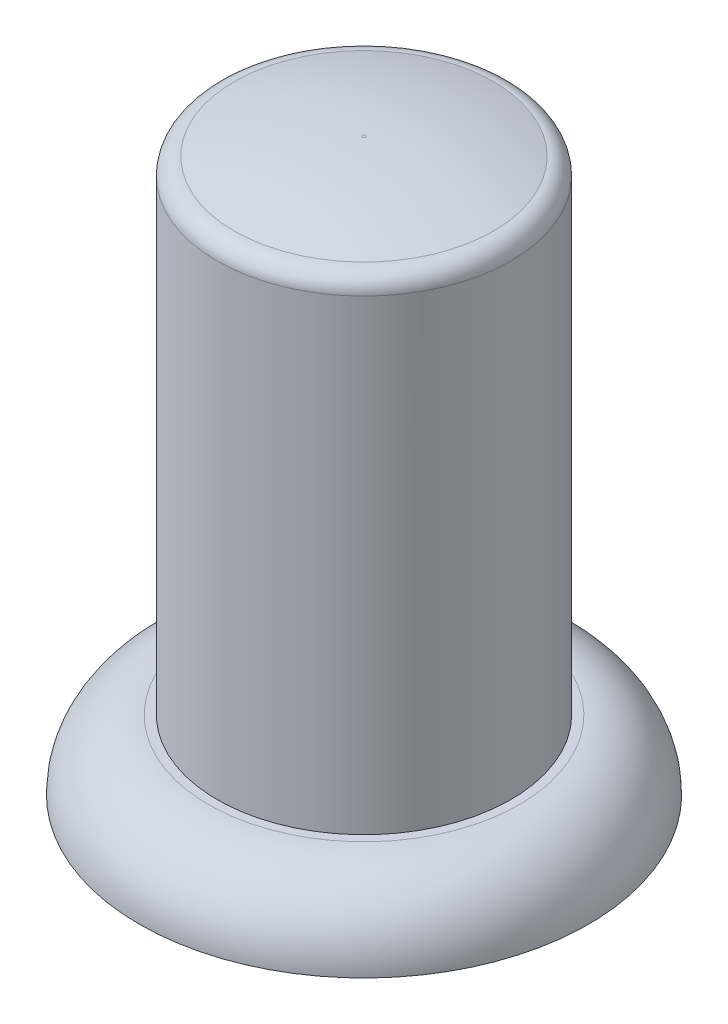
ISO-10303-21;
HEADER;
FILE_DESCRIPTION(('STEP AP214'),'2;1');
FILE_NAME('part.step','',(''),(''),'','','');
FILE_SCHEMA(('AUTOMOTIVE_DESIGN { 1 0 10303 214 1 1 1 1 }'));
ENDSEC;
DATA;
#1=APPLICATION_CONTEXT('core data for automotive mechanical design processes');
#2=APPLICATION_PROTOCOL_DEFINITION('international standard','automotive_design',2000,#1);
#3=PRODUCT_CONTEXT('',#1,'mechanical');
#4=PRODUCT('Part','Part','',(#3));
#5=PRODUCT_RELATED_PRODUCT_CATEGORY('part','',(#4));
#6=PRODUCT_DEFINITION_FORMATION('','',#4);
#7=PRODUCT_DEFINITION_CONTEXT('part definition',#1,'design');
#8=PRODUCT_DEFINITION('design','',#6,#7);
#9=PRODUCT_DEFINITION_SHAPE('','',#8);
#10=(LENGTH_UNIT() NAMED_UNIT(*) SI_UNIT(.MILLI.,.METRE.));
#11=(NAMED_UNIT(*) PLANE_ANGLE_UNIT() SI_UNIT($,.RADIAN.));
#12=(NAMED_UNIT(*) SI_UNIT($,.STERADIAN.) SOLID_ANGLE_UNIT());
#13=UNCERTAINTY_MEASURE_WITH_UNIT(LENGTH_MEASURE(1.E-05),#10,'distance_accuracy_value','');
#14=(GEOMETRIC_REPRESENTATION_CONTEXT(3) GLOBAL_UNCERTAINTY_ASSIGNED_CONTEXT((#13)) GLOBAL_UNIT_ASSIGNED_CONTEXT((#10,
#11,#12)) REPRESENTATION_CONTEXT('',''));
#15=CARTESIAN_POINT('',(0.,0.,0.));
#16=DIRECTION('',(0.,0.,1.));
#17=DIRECTION('',(1.,0.,0.));
#18=AXIS2_PLACEMENT_3D('',#15,#16,#17);
#19=CARTESIAN_POINT('',(0.,16.,0.));
#20=DIRECTION('',(0.,-1.,0.));
#21=DIRECTION('',(0.,0.,-1.));
#22=AXIS2_PLACEMENT_3D('',#19,#20,#21);
#23=CYLINDRICAL_SURFACE('',#22,4.25);
#24=CARTESIAN_POINT('',(0.,15.5,0.));
#25=DIRECTION('',(0.,1.,0.));
#26=DIRECTION('',(0.,0.,1.));
#27=AXIS2_PLACEMENT_3D('',#24,#25,#26);
#28=CIRCLE('',#27,4.25);
#29=CARTESIAN_POINT('',(0.,15.5,4.25));
#30=VERTEX_POINT('',#29);
#31=EDGE_CURVE('E87',#30,#30,#28,.F.);
#32=ORIENTED_EDGE('',*,*,#31,.T.);
#33=EDGE_LOOP('',(#32));
#34=FACE_BOUND('',#33,.T.);
#35=CARTESIAN_POINT('',(0.,2.,0.));
#36=DIRECTION('',(0.,-1.,0.));
#37=DIRECTION('',(0.,0.,-1.));
#38=AXIS2_PLACEMENT_3D('',#35,#36,#37);
#39=CIRCLE('',#38,4.25);
#40=CARTESIAN_POINT('',(0.,2.,-4.25));
#41=VERTEX_POINT('',#40);
#42=EDGE_CURVE('E43',#41,#41,#39,.T.);
#43=ORIENTED_EDGE('',*,*,#42,.F.);
#44=EDGE_LOOP('',(#43));
#45=FACE_BOUND('',#44,.T.);
#46=ADVANCED_FACE('F35',(#34,#45),#23,.T.);
#47=CARTESIAN_POINT('',(0.,15.5,0.));
#48=DIRECTION('',(0.,1.,0.));
#49=DIRECTION('',(0.,0.,1.));
#50=AXIS2_PLACEMENT_3D('',#47,#48,#49);
#51=TOROIDAL_SURFACE('',#50,3.75,0.5);
#52=ORIENTED_EDGE('',*,*,#31,.F.);
#53=EDGE_LOOP('',(#52));
#54=FACE_BOUND('',#53,.T.);
#55=CARTESIAN_POINT('',(0.,16.,0.));
#56=DIRECTION('',(0.,1.,0.));
#57=DIRECTION('',(0.,0.,1.));
#58=AXIS2_PLACEMENT_3D('',#55,#56,#57);
#59=CIRCLE('',#58,3.75);
#60=CARTESIAN_POINT('',(0.,16.,3.75));
#61=VERTEX_POINT('',#60);
#62=EDGE_CURVE('E80',#61,#61,#59,.T.);
#63=ORIENTED_EDGE('',*,*,#62,.F.);
#64=EDGE_LOOP('',(#63));
#65=FACE_BOUND('',#64,.T.);
#66=ADVANCED_FACE('F124',(#54,#65),#51,.T.);
#67=CARTESIAN_POINT('',(0.,16.5,0.));
#68=DIRECTION('',(0.,1.,0.));
#69=DIRECTION('',(0.,0.,1.));
#70=AXIS2_PLACEMENT_3D('',#67,#68,#69);
#71=PLANE('',#70);
#72=CARTESIAN_POINT('',(0.,16.5,0.));
#73=DIRECTION('',(0.,1.,0.));
#74=DIRECTION('',(0.,0.,1.));
#75=AXIS2_PLACEMENT_3D('',#72,#73,#74);
#76=CIRCLE('',#75,0.0419007564521653);
#77=CARTESIAN_POINT('',(0.,16.5,0.0419007564521653));
#78=VERTEX_POINT('',#77);
#79=EDGE_CURVE('E89',#78,#78,#76,.T.);
#80=ORIENTED_EDGE('',*,*,#79,.T.);
#81=EDGE_LOOP('',(#80));
#82=FACE_BOUND('',#81,.T.);
#83=ADVANCED_FACE('F130',(#82),#71,.T.);
#84=CARTESIAN_POINT('',(0.,2.5,0.));
#85=DIRECTION('',(0.,-1.,0.));
#86=DIRECTION('',(0.,0.,-1.));
#87=AXIS2_PLACEMENT_3D('',#84,#85,#86);
#88=DEGENERATE_TOROIDAL_SURFACE('',#87,0.0419007564521653,14.,.T.);
#89=ORIENTED_EDGE('',*,*,#62,.T.);
#90=EDGE_LOOP('',(#89));
#91=FACE_BOUND('',#90,.T.);
#92=ORIENTED_EDGE('',*,*,#79,.F.);
#93=EDGE_LOOP('',(#92));
#94=FACE_BOUND('',#93,.T.);
#95=ADVANCED_FACE('F135',(#91,#94),#88,.T.);
#96=CARTESIAN_POINT('',(0.,2.,0.));
#97=DIRECTION('',(0.,-1.,0.));
#98=DIRECTION('',(0.,0.,-1.));
#99=AXIS2_PLACEMENT_3D('',#96,#97,#98);
#100=PLANE('',#99);
#101=CARTESIAN_POINT('',(0.,2.,0.));
#102=DIRECTION('',(0.,-1.,0.));
#103=DIRECTION('',(0.,0.,-1.));
#104=AXIS2_PLACEMENT_3D('',#101,#102,#103);
#105=CIRCLE('',#104,4.5);
#106=CARTESIAN_POINT('',(0.,2.,-4.5));
#107=VERTEX_POINT('',#106);
#108=EDGE_CURVE('E12',#107,#107,#105,.F.);
#109=ORIENTED_EDGE('',*,*,#108,.T.);
#110=EDGE_LOOP('',(#109));
#111=FACE_BOUND('',#110,.T.);
#112=ORIENTED_EDGE('',*,*,#42,.T.);
#113=EDGE_LOOP('',(#112));
#114=FACE_BOUND('',#113,.T.);
#115=ADVANCED_FACE('F110',(#111,#114),#100,.F.);
#116=CARTESIAN_POINT('',(0.,0.,0.));
#117=DIRECTION('',(0.,1.,0.));
#118=DIRECTION('',(0.,0.,1.));
#119=AXIS2_PLACEMENT_3D('',#116,#117,#118);
#120=PLANE('',#119);
#121=CARTESIAN_POINT('',(0.,0.,0.));
#122=DIRECTION('',(0.,-1.,0.));
#123=DIRECTION('',(0.,0.,-1.));
#124=AXIS2_PLACEMENT_3D('',#121,#122,#123);
#125=CIRCLE('',#124,3.5);
#126=CARTESIAN_POINT('',(0.,0.,-3.5));
#127=VERTEX_POINT('',#126);
#128=EDGE_CURVE('E101',#127,#127,#125,.T.);
#129=ORIENTED_EDGE('',*,*,#128,.F.);
#130=EDGE_LOOP('',(#129));
#131=FACE_BOUND('',#130,.T.);
#132=CARTESIAN_POINT('',(0.,0.,0.));
#133=DIRECTION('',(0.,-1.,0.));
#134=DIRECTION('',(0.,0.,-1.));
#135=AXIS2_PLACEMENT_3D('',#132,#133,#134);
#136=CIRCLE('',#135,6.5);
#137=CARTESIAN_POINT('',(0.,0.,-6.5));
#138=VERTEX_POINT('',#137);
#139=EDGE_CURVE('E69',#138,#138,#136,.T.);
#140=ORIENTED_EDGE('',*,*,#139,.T.);
#141=EDGE_LOOP('',(#140));
#142=FACE_BOUND('',#141,.T.);
#143=ADVANCED_FACE('F107',(#131,#142),#120,.F.);
#144=CARTESIAN_POINT('',(0.,15.,0.));
#145=DIRECTION('',(0.,-1.,0.));
#146=DIRECTION('',(0.,0.,-1.));
#147=AXIS2_PLACEMENT_3D('',#144,#145,#146);
#148=PLANE('',#147);
#149=CARTESIAN_POINT('',(0.,15.,0.));
#150=DIRECTION('',(0.,-1.,0.));
#151=DIRECTION('',(0.,0.,-1.));
#152=AXIS2_PLACEMENT_3D('',#149,#150,#151);
#153=CIRCLE('',#152,3.);
#154=CARTESIAN_POINT('',(1.5,15.,2.59807621135332));
#155=VERTEX_POINT('',#154);
#156=CARTESIAN_POINT('',(1.5,15.,-2.59807621135332));
#157=VERTEX_POINT('',#156);
#158=EDGE_CURVE('E73',#155,#157,#153,.T.);
#159=ORIENTED_EDGE('',*,*,#158,.T.);
#160=DIRECTION('',(0.,0.,-1.));
#161=VECTOR('',#160,1.);
#162=CARTESIAN_POINT('',(1.5,15.,-2.59807621135332));
#163=LINE('',#162,#161);
#164=EDGE_CURVE('E61',#155,#157,#163,.T.);
#165=ORIENTED_EDGE('',*,*,#164,.F.);
#166=EDGE_LOOP('',(#159,#165));
#167=FACE_BOUND('',#166,.T.);
#168=ADVANCED_FACE('F76',(#167),#148,.T.);
#169=CARTESIAN_POINT('',(1.5,5.,-2.59807621135332));
#170=DIRECTION('',(1.,0.,0.));
#171=DIRECTION('',(0.,0.,-1.));
#172=AXIS2_PLACEMENT_3D('',#169,#170,#171);
#173=PLANE('',#172);
#174=ORIENTED_EDGE('',*,*,#164,.T.);
#175=DIRECTION('',(0.,1.,0.));
#176=VECTOR('',#175,1.);
#177=CARTESIAN_POINT('',(1.5,5.,-2.59807621135332));
#178=LINE('',#177,#176);
#179=CARTESIAN_POINT('',(1.5,5.,-2.59807621135332));
#180=VERTEX_POINT('',#179);
#181=EDGE_CURVE('E64',#180,#157,#178,.T.);
#182=ORIENTED_EDGE('',*,*,#181,.F.);
#183=DIRECTION('',(0.,0.,-1.));
#184=VECTOR('',#183,1.);
#185=CARTESIAN_POINT('',(1.5,5.,-2.59807621135332));
#186=LINE('',#185,#184);
#187=CARTESIAN_POINT('',(1.5,5.,2.59807621135332));
#188=VERTEX_POINT('',#187);
#189=EDGE_CURVE('E57',#188,#180,#186,.T.);
#190=ORIENTED_EDGE('',*,*,#189,.F.);
#191=DIRECTION('',(0.,1.,0.));
#192=VECTOR('',#191,1.);
#193=CARTESIAN_POINT('',(1.5,5.,2.59807621135332));
#194=LINE('',#193,#192);
#195=EDGE_CURVE('E50',#188,#155,#194,.T.);
#196=ORIENTED_EDGE('',*,*,#195,.T.);
#197=EDGE_LOOP('',(#174,#182,#190,#196));
#198=FACE_BOUND('',#197,.T.);
#199=ADVANCED_FACE('F63',(#198),#173,.F.);
#200=CARTESIAN_POINT('',(0.,15.,0.));
#201=DIRECTION('',(0.,-1.,0.));
#202=DIRECTION('',(0.,0.,-1.));
#203=AXIS2_PLACEMENT_3D('',#200,#201,#202);
#204=CYLINDRICAL_SURFACE('',#203,3.);
#205=ORIENTED_EDGE('',*,*,#195,.F.);
#206=CARTESIAN_POINT('',(0.,5.,0.));
#207=DIRECTION('',(0.,-1.,0.));
#208=DIRECTION('',(0.,0.,-1.));
#209=AXIS2_PLACEMENT_3D('',#206,#207,#208);
#210=CIRCLE('',#209,3.);
#211=EDGE_CURVE('E74',#188,#180,#210,.T.);
#212=ORIENTED_EDGE('',*,*,#211,.T.);
#213=ORIENTED_EDGE('',*,*,#181,.T.);
#214=ORIENTED_EDGE('',*,*,#158,.F.);
#215=EDGE_LOOP('',(#205,#212,#213,#214));
#216=FACE_BOUND('',#215,.T.);
#217=ADVANCED_FACE('F72',(#216),#204,.F.);
#218=CARTESIAN_POINT('',(0.,5.,0.));
#219=DIRECTION('',(0.,-1.,0.));
#220=DIRECTION('',(0.,0.,-1.));
#221=AXIS2_PLACEMENT_3D('',#218,#219,#220);
#222=PLANE('',#221);
#223=CARTESIAN_POINT('',(0.,5.,0.));
#224=DIRECTION('',(0.,-1.,0.));
#225=DIRECTION('',(0.,0.,-1.));
#226=AXIS2_PLACEMENT_3D('',#223,#224,#225);
#227=CIRCLE('',#226,3.5);
#228=CARTESIAN_POINT('',(0.,5.,-3.5));
#229=VERTEX_POINT('',#228);
#230=EDGE_CURVE('E77',#229,#229,#227,.T.);
#231=ORIENTED_EDGE('',*,*,#230,.T.);
#232=EDGE_LOOP('',(#231));
#233=FACE_BOUND('',#232,.T.);
#234=ORIENTED_EDGE('',*,*,#211,.F.);
#235=ORIENTED_EDGE('',*,*,#189,.T.);
#236=EDGE_LOOP('',(#234,#235));
#237=FACE_BOUND('',#236,.T.);
#238=ADVANCED_FACE('F119',(#233,#237),#222,.T.);
#239=CARTESIAN_POINT('',(0.,5.,0.));
#240=DIRECTION('',(0.,-1.,0.));
#241=DIRECTION('',(0.,0.,-1.));
#242=AXIS2_PLACEMENT_3D('',#239,#240,#241);
#243=CYLINDRICAL_SURFACE('',#242,3.5);
#244=ORIENTED_EDGE('',*,*,#230,.F.);
#245=EDGE_LOOP('',(#244));
#246=FACE_BOUND('',#245,.T.);
#247=ORIENTED_EDGE('',*,*,#128,.T.);
#248=EDGE_LOOP('',(#247));
#249=FACE_BOUND('',#248,.T.);
#250=ADVANCED_FACE('F105',(#246,#249),#243,.F.);
#251=CARTESIAN_POINT('',(0.,0.,0.));
#252=DIRECTION('',(0.,-1.,0.));
#253=DIRECTION('',(0.,0.,-1.));
#254=AXIS2_PLACEMENT_3D('',#251,#252,#253);
#255=TOROIDAL_SURFACE('',#254,4.5,2.);
#256=ORIENTED_EDGE('',*,*,#108,.F.);
#257=EDGE_LOOP('',(#256));
#258=FACE_BOUND('',#257,.T.);
#259=ORIENTED_EDGE('',*,*,#139,.F.);
#260=EDGE_LOOP('',(#259));
#261=FACE_BOUND('',#260,.T.);
#262=ADVANCED_FACE('F37',(#258,#261),#255,.T.);
#263=CLOSED_SHELL('',(#46,#66,#83,#95,#115,#143,#168,#199,#217,#238,#250,#262));
#264=MANIFOLD_SOLID_BREP('B2',#263);
#265=ADVANCED_BREP_SHAPE_REPRESENTATION('',(#18,#264),#14);
#266=SHAPE_DEFINITION_REPRESENTATION(#9,#265);
ENDSEC;
END-ISO-10303-21;
